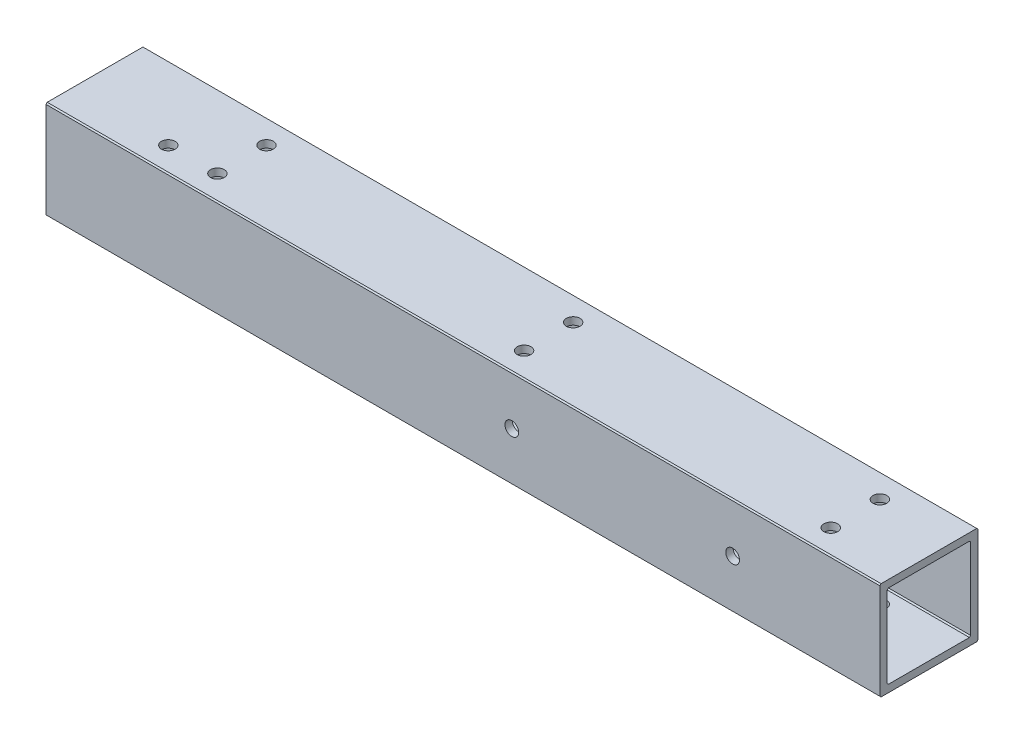
ISO-10303-21;
HEADER;
FILE_DESCRIPTION(('STEP AP214'),'2;1');
FILE_NAME('part.step','',(''),(''),'','','');
FILE_SCHEMA(('AUTOMOTIVE_DESIGN { 1 0 10303 214 1 1 1 1 }'));
ENDSEC;
DATA;
#1=APPLICATION_CONTEXT('core data for automotive mechanical design processes');
#2=APPLICATION_PROTOCOL_DEFINITION('international standard','automotive_design',2000,#1);
#3=PRODUCT_CONTEXT('',#1,'mechanical');
#4=PRODUCT('Part','Part','',(#3));
#5=PRODUCT_RELATED_PRODUCT_CATEGORY('part','',(#4));
#6=PRODUCT_DEFINITION_FORMATION('','',#4);
#7=PRODUCT_DEFINITION_CONTEXT('part definition',#1,'design');
#8=PRODUCT_DEFINITION('design','',#6,#7);
#9=PRODUCT_DEFINITION_SHAPE('','',#8);
#10=(LENGTH_UNIT() NAMED_UNIT(*) SI_UNIT(.MILLI.,.METRE.));
#11=(NAMED_UNIT(*) PLANE_ANGLE_UNIT() SI_UNIT($,.RADIAN.));
#12=(NAMED_UNIT(*) SI_UNIT($,.STERADIAN.) SOLID_ANGLE_UNIT());
#13=UNCERTAINTY_MEASURE_WITH_UNIT(LENGTH_MEASURE(1.E-05),#10,'distance_accuracy_value','');
#14=(GEOMETRIC_REPRESENTATION_CONTEXT(3) GLOBAL_UNCERTAINTY_ASSIGNED_CONTEXT((#13)) GLOBAL_UNIT_ASSIGNED_CONTEXT((#10,
#11,#12)) REPRESENTATION_CONTEXT('',''));
#15=CARTESIAN_POINT('',(0.,0.,0.));
#16=DIRECTION('',(0.,0.,1.));
#17=DIRECTION('',(1.,0.,0.));
#18=AXIS2_PLACEMENT_3D('',#15,#16,#17);
#19=CARTESIAN_POINT('',(-89.85,-142.,140.));
#20=DIRECTION('',(0.,0.,1.));
#21=DIRECTION('',(1.,0.,0.));
#22=AXIS2_PLACEMENT_3D('',#19,#20,#21);
#23=PLANE('',#22);
#24=CARTESIAN_POINT('',(190.,-122.,140.));
#25=DIRECTION('',(0.,0.,-1.));
#26=DIRECTION('',(-1.,0.,0.));
#27=AXIS2_PLACEMENT_3D('',#24,#25,#26);
#28=CIRCLE('',#27,2.8);
#29=CARTESIAN_POINT('',(187.2,-122.,140.));
#30=VERTEX_POINT('',#29);
#31=EDGE_CURVE('E605',#30,#30,#28,.T.);
#32=ORIENTED_EDGE('',*,*,#31,.T.);
#33=EDGE_LOOP('',(#32));
#34=FACE_BOUND('',#33,.T.);
#35=CARTESIAN_POINT('',(100.,-122.,140.));
#36=DIRECTION('',(0.,0.,-1.));
#37=DIRECTION('',(-1.,0.,0.));
#38=AXIS2_PLACEMENT_3D('',#35,#36,#37);
#39=CIRCLE('',#38,2.79999999999998);
#40=CARTESIAN_POINT('',(97.2,-122.,140.));
#41=VERTEX_POINT('',#40);
#42=EDGE_CURVE('E617',#41,#41,#39,.T.);
#43=ORIENTED_EDGE('',*,*,#42,.T.);
#44=EDGE_LOOP('',(#43));
#45=FACE_BOUND('',#44,.T.);
#46=DIRECTION('',(0.,1.,0.));
#47=VECTOR('',#46,1.);
#48=CARTESIAN_POINT('',(250.,-142.,140.));
#49=LINE('',#48,#47);
#50=CARTESIAN_POINT('',(250.,-141.5,140.));
#51=VERTEX_POINT('',#50);
#52=CARTESIAN_POINT('',(250.,-102.5,140.));
#53=VERTEX_POINT('',#52);
#54=EDGE_CURVE('E185',#51,#53,#49,.T.);
#55=ORIENTED_EDGE('',*,*,#54,.T.);
#56=DIRECTION('',(-1.,0.,0.));
#57=VECTOR('',#56,1.);
#58=CARTESIAN_POINT('',(-89.85,-102.5,140.));
#59=LINE('',#58,#57);
#60=CARTESIAN_POINT('',(-89.85,-102.5,140.));
#61=VERTEX_POINT('',#60);
#62=EDGE_CURVE('E229',#53,#61,#59,.T.);
#63=ORIENTED_EDGE('',*,*,#62,.T.);
#64=DIRECTION('',(0.,1.,0.));
#65=VECTOR('',#64,1.);
#66=CARTESIAN_POINT('',(-89.85,-142.,140.));
#67=LINE('',#66,#65);
#68=CARTESIAN_POINT('',(-89.85,-141.5,140.));
#69=VERTEX_POINT('',#68);
#70=EDGE_CURVE('E196',#69,#61,#67,.T.);
#71=ORIENTED_EDGE('',*,*,#70,.F.);
#72=DIRECTION('',(1.,0.,0.));
#73=VECTOR('',#72,1.);
#74=CARTESIAN_POINT('',(250.,-141.5,140.));
#75=LINE('',#74,#73);
#76=EDGE_CURVE('E226',#69,#51,#75,.T.);
#77=ORIENTED_EDGE('',*,*,#76,.T.);
#78=EDGE_LOOP('',(#55,#63,#71,#77));
#79=FACE_BOUND('',#78,.T.);
#80=ADVANCED_FACE('F45',(#34,#45,#79),#23,.T.);
#81=CARTESIAN_POINT('',(-89.85,-142.,100.));
#82=DIRECTION('',(-1.,0.,0.));
#83=DIRECTION('',(0.,0.,1.));
#84=AXIS2_PLACEMENT_3D('',#81,#82,#83);
#85=PLANE('',#84);
#86=DIRECTION('',(0.,-1.,0.));
#87=VECTOR('',#86,1.);
#88=CARTESIAN_POINT('',(-89.85,-105.,103.));
#89=LINE('',#88,#87);
#90=CARTESIAN_POINT('',(-89.85,-105.5,103.));
#91=VERTEX_POINT('',#90);
#92=CARTESIAN_POINT('',(-89.85,-138.5,103.));
#93=VERTEX_POINT('',#92);
#94=EDGE_CURVE('E286',#91,#93,#89,.T.);
#95=ORIENTED_EDGE('',*,*,#94,.F.);
#96=DIRECTION('',(0.,-0.707106781186548,-0.707106781186548));
#97=VECTOR('',#96,1.);
#98=CARTESIAN_POINT('',(-89.85,-105.5,103.));
#99=LINE('',#98,#97);
#100=CARTESIAN_POINT('',(-89.85,-105.,103.5));
#101=VERTEX_POINT('',#100);
#102=EDGE_CURVE('E55',#91,#101,#99,.F.);
#103=ORIENTED_EDGE('',*,*,#102,.T.);
#104=DIRECTION('',(0.,0.,-1.));
#105=VECTOR('',#104,1.);
#106=CARTESIAN_POINT('',(-89.85,-105.,137.));
#107=LINE('',#106,#105);
#108=CARTESIAN_POINT('',(-89.85,-105.,136.5));
#109=VERTEX_POINT('',#108);
#110=EDGE_CURVE('E284',#109,#101,#107,.T.);
#111=ORIENTED_EDGE('',*,*,#110,.F.);
#112=DIRECTION('',(0.,0.707106781186548,-0.707106781186548));
#113=VECTOR('',#112,1.);
#114=CARTESIAN_POINT('',(-89.85,-105.,136.5));
#115=LINE('',#114,#113);
#116=CARTESIAN_POINT('',(-89.85,-105.5,137.));
#117=VERTEX_POINT('',#116);
#118=EDGE_CURVE('E260',#109,#117,#115,.F.);
#119=ORIENTED_EDGE('',*,*,#118,.T.);
#120=DIRECTION('',(0.,1.,0.));
#121=VECTOR('',#120,1.);
#122=CARTESIAN_POINT('',(-89.85,-139.,137.));
#123=LINE('',#122,#121);
#124=CARTESIAN_POINT('',(-89.85,-138.5,137.));
#125=VERTEX_POINT('',#124);
#126=EDGE_CURVE('E297',#125,#117,#123,.T.);
#127=ORIENTED_EDGE('',*,*,#126,.F.);
#128=DIRECTION('',(0.,0.707106781186548,0.707106781186548));
#129=VECTOR('',#128,1.);
#130=CARTESIAN_POINT('',(-89.85,-138.5,137.));
#131=LINE('',#130,#129);
#132=CARTESIAN_POINT('',(-89.85,-139.,136.5));
#133=VERTEX_POINT('',#132);
#134=EDGE_CURVE('E272',#125,#133,#131,.F.);
#135=ORIENTED_EDGE('',*,*,#134,.T.);
#136=DIRECTION('',(0.,0.,1.));
#137=VECTOR('',#136,1.);
#138=CARTESIAN_POINT('',(-89.85,-139.,103.));
#139=LINE('',#138,#137);
#140=CARTESIAN_POINT('',(-89.85,-139.,103.5));
#141=VERTEX_POINT('',#140);
#142=EDGE_CURVE('E327',#141,#133,#139,.T.);
#143=ORIENTED_EDGE('',*,*,#142,.F.);
#144=DIRECTION('',(0.,-0.707106781186548,0.707106781186548));
#145=VECTOR('',#144,1.);
#146=CARTESIAN_POINT('',(-89.85,-139.,103.5));
#147=LINE('',#146,#145);
#148=EDGE_CURVE('E266',#141,#93,#147,.F.);
#149=ORIENTED_EDGE('',*,*,#148,.T.);
#150=EDGE_LOOP('',(#95,#103,#111,#119,#127,#135,#143,#149));
#151=FACE_BOUND('',#150,.T.);
#152=DIRECTION('',(0.,1.,0.));
#153=VECTOR('',#152,1.);
#154=CARTESIAN_POINT('',(-89.85,-142.,100.));
#155=LINE('',#154,#153);
#156=CARTESIAN_POINT('',(-89.85,-141.5,100.));
#157=VERTEX_POINT('',#156);
#158=CARTESIAN_POINT('',(-89.85,-102.5,100.));
#159=VERTEX_POINT('',#158);
#160=EDGE_CURVE('E184',#157,#159,#155,.T.);
#161=ORIENTED_EDGE('',*,*,#160,.F.);
#162=DIRECTION('',(0.,-0.707106781186548,0.707106781186548));
#163=VECTOR('',#162,1.);
#164=CARTESIAN_POINT('',(-89.85,-141.75,100.25));
#165=LINE('',#164,#163);
#166=CARTESIAN_POINT('',(-89.85,-142.,100.5));
#167=VERTEX_POINT('',#166);
#168=EDGE_CURVE('E188',#157,#167,#165,.T.);
#169=ORIENTED_EDGE('',*,*,#168,.T.);
#170=DIRECTION('',(0.,0.,1.));
#171=VECTOR('',#170,1.);
#172=CARTESIAN_POINT('',(-89.85,-142.,100.));
#173=LINE('',#172,#171);
#174=CARTESIAN_POINT('',(-89.85,-142.,139.5));
#175=VERTEX_POINT('',#174);
#176=EDGE_CURVE('E336',#167,#175,#173,.T.);
#177=ORIENTED_EDGE('',*,*,#176,.T.);
#178=DIRECTION('',(0.,0.707106781186548,0.707106781186548));
#179=VECTOR('',#178,1.);
#180=CARTESIAN_POINT('',(-89.85,-161.75,119.75));
#181=LINE('',#180,#179);
#182=EDGE_CURVE('E190',#175,#69,#181,.T.);
#183=ORIENTED_EDGE('',*,*,#182,.T.);
#184=ORIENTED_EDGE('',*,*,#70,.T.);
#185=DIRECTION('',(0.,-0.707106781186548,0.707106781186548));
#186=VECTOR('',#185,1.);
#187=CARTESIAN_POINT('',(-89.85,-102.25,139.75));
#188=LINE('',#187,#186);
#189=CARTESIAN_POINT('',(-89.85,-102.,139.5));
#190=VERTEX_POINT('',#189);
#191=EDGE_CURVE('E194',#61,#190,#188,.F.);
#192=ORIENTED_EDGE('',*,*,#191,.T.);
#193=DIRECTION('',(0.,0.,1.));
#194=VECTOR('',#193,1.);
#195=CARTESIAN_POINT('',(-89.85,-102.,100.));
#196=LINE('',#195,#194);
#197=CARTESIAN_POINT('',(-89.85,-102.,100.5));
#198=VERTEX_POINT('',#197);
#199=EDGE_CURVE('E337',#198,#190,#196,.T.);
#200=ORIENTED_EDGE('',*,*,#199,.F.);
#201=DIRECTION('',(0.,0.707106781186548,0.707106781186548));
#202=VECTOR('',#201,1.);
#203=CARTESIAN_POINT('',(-89.85,-122.25,80.25));
#204=LINE('',#203,#202);
#205=EDGE_CURVE('E202',#198,#159,#204,.F.);
#206=ORIENTED_EDGE('',*,*,#205,.T.);
#207=EDGE_LOOP('',(#161,#169,#177,#183,#184,#192,#200,#206));
#208=FACE_BOUND('',#207,.T.);
#209=ADVANCED_FACE('F282',(#151,#208),#85,.T.);
#210=CARTESIAN_POINT('',(250.,-142.,100.));
#211=DIRECTION('',(0.,0.,-1.));
#212=DIRECTION('',(-1.,0.,0.));
#213=AXIS2_PLACEMENT_3D('',#210,#211,#212);
#214=PLANE('',#213);
#215=CARTESIAN_POINT('',(190.,-122.,100.));
#216=DIRECTION('',(0.,0.,-1.));
#217=DIRECTION('',(-1.,0.,0.));
#218=AXIS2_PLACEMENT_3D('',#215,#216,#217);
#219=CIRCLE('',#218,2.8);
#220=CARTESIAN_POINT('',(187.2,-122.,100.));
#221=VERTEX_POINT('',#220);
#222=EDGE_CURVE('E476',#221,#221,#219,.T.);
#223=ORIENTED_EDGE('',*,*,#222,.F.);
#224=EDGE_LOOP('',(#223));
#225=FACE_BOUND('',#224,.T.);
#226=CARTESIAN_POINT('',(100.,-122.,100.));
#227=DIRECTION('',(0.,0.,-1.));
#228=DIRECTION('',(-1.,0.,0.));
#229=AXIS2_PLACEMENT_3D('',#226,#227,#228);
#230=CIRCLE('',#229,2.79999999999998);
#231=CARTESIAN_POINT('',(97.2,-122.,100.));
#232=VERTEX_POINT('',#231);
#233=EDGE_CURVE('E479',#232,#232,#230,.T.);
#234=ORIENTED_EDGE('',*,*,#233,.F.);
#235=EDGE_LOOP('',(#234));
#236=FACE_BOUND('',#235,.T.);
#237=DIRECTION('',(0.,1.,0.));
#238=VECTOR('',#237,1.);
#239=CARTESIAN_POINT('',(250.,-142.,100.));
#240=LINE('',#239,#238);
#241=CARTESIAN_POINT('',(250.,-141.5,100.));
#242=VERTEX_POINT('',#241);
#243=CARTESIAN_POINT('',(250.,-102.5,100.));
#244=VERTEX_POINT('',#243);
#245=EDGE_CURVE('E164',#242,#244,#240,.T.);
#246=ORIENTED_EDGE('',*,*,#245,.F.);
#247=DIRECTION('',(-1.,0.,0.));
#248=VECTOR('',#247,1.);
#249=CARTESIAN_POINT('',(-89.85,-141.5,100.));
#250=LINE('',#249,#248);
#251=EDGE_CURVE('E179',#242,#157,#250,.T.);
#252=ORIENTED_EDGE('',*,*,#251,.T.);
#253=ORIENTED_EDGE('',*,*,#160,.T.);
#254=DIRECTION('',(1.,0.,0.));
#255=VECTOR('',#254,1.);
#256=CARTESIAN_POINT('',(250.,-102.5,100.));
#257=LINE('',#256,#255);
#258=EDGE_CURVE('E182',#159,#244,#257,.T.);
#259=ORIENTED_EDGE('',*,*,#258,.T.);
#260=EDGE_LOOP('',(#246,#252,#253,#259));
#261=FACE_BOUND('',#260,.T.);
#262=ADVANCED_FACE('F177',(#225,#236,#261),#214,.T.);
#263=CARTESIAN_POINT('',(250.,-142.,140.));
#264=DIRECTION('',(1.,0.,0.));
#265=DIRECTION('',(0.,0.,-1.));
#266=AXIS2_PLACEMENT_3D('',#263,#264,#265);
#267=PLANE('',#266);
#268=DIRECTION('',(0.,0.,-1.));
#269=VECTOR('',#268,1.);
#270=CARTESIAN_POINT('',(250.,-105.,137.));
#271=LINE('',#270,#269);
#272=CARTESIAN_POINT('',(250.,-105.,136.5));
#273=VERTEX_POINT('',#272);
#274=CARTESIAN_POINT('',(250.,-105.,103.5));
#275=VERTEX_POINT('',#274);
#276=EDGE_CURVE('E304',#273,#275,#271,.T.);
#277=ORIENTED_EDGE('',*,*,#276,.T.);
#278=DIRECTION('',(0.,0.707106781186548,0.707106781186548));
#279=VECTOR('',#278,1.);
#280=CARTESIAN_POINT('',(250.,-105.5,103.));
#281=LINE('',#280,#279);
#282=CARTESIAN_POINT('',(250.,-105.5,103.));
#283=VERTEX_POINT('',#282);
#284=EDGE_CURVE('E11',#275,#283,#281,.F.);
#285=ORIENTED_EDGE('',*,*,#284,.T.);
#286=DIRECTION('',(0.,-1.,0.));
#287=VECTOR('',#286,1.);
#288=CARTESIAN_POINT('',(250.,-105.,103.));
#289=LINE('',#288,#287);
#290=CARTESIAN_POINT('',(250.,-138.5,103.));
#291=VERTEX_POINT('',#290);
#292=EDGE_CURVE('E296',#283,#291,#289,.T.);
#293=ORIENTED_EDGE('',*,*,#292,.T.);
#294=DIRECTION('',(0.,0.707106781186548,-0.707106781186548));
#295=VECTOR('',#294,1.);
#296=CARTESIAN_POINT('',(250.,-139.,103.5));
#297=LINE('',#296,#295);
#298=CARTESIAN_POINT('',(250.,-139.,103.5));
#299=VERTEX_POINT('',#298);
#300=EDGE_CURVE('E269',#291,#299,#297,.F.);
#301=ORIENTED_EDGE('',*,*,#300,.T.);
#302=DIRECTION('',(0.,0.,1.));
#303=VECTOR('',#302,1.);
#304=CARTESIAN_POINT('',(250.,-139.,103.));
#305=LINE('',#304,#303);
#306=CARTESIAN_POINT('',(250.,-139.,136.5));
#307=VERTEX_POINT('',#306);
#308=EDGE_CURVE('E309',#299,#307,#305,.T.);
#309=ORIENTED_EDGE('',*,*,#308,.T.);
#310=DIRECTION('',(0.,-0.707106781186548,-0.707106781186548));
#311=VECTOR('',#310,1.);
#312=CARTESIAN_POINT('',(250.,-138.5,137.));
#313=LINE('',#312,#311);
#314=CARTESIAN_POINT('',(250.,-138.5,137.));
#315=VERTEX_POINT('',#314);
#316=EDGE_CURVE('E275',#307,#315,#313,.F.);
#317=ORIENTED_EDGE('',*,*,#316,.T.);
#318=DIRECTION('',(0.,1.,0.));
#319=VECTOR('',#318,1.);
#320=CARTESIAN_POINT('',(250.,-139.,137.));
#321=LINE('',#320,#319);
#322=CARTESIAN_POINT('',(250.,-105.5,137.));
#323=VERTEX_POINT('',#322);
#324=EDGE_CURVE('E313',#315,#323,#321,.T.);
#325=ORIENTED_EDGE('',*,*,#324,.T.);
#326=DIRECTION('',(0.,-0.707106781186548,0.707106781186548));
#327=VECTOR('',#326,1.);
#328=CARTESIAN_POINT('',(250.,-105.,136.5));
#329=LINE('',#328,#327);
#330=EDGE_CURVE('E263',#323,#273,#329,.F.);
#331=ORIENTED_EDGE('',*,*,#330,.T.);
#332=EDGE_LOOP('',(#277,#285,#293,#301,#309,#317,#325,#331));
#333=FACE_BOUND('',#332,.T.);
#334=DIRECTION('',(0.,0.,-1.));
#335=VECTOR('',#334,1.);
#336=CARTESIAN_POINT('',(250.,-142.,140.));
#337=LINE('',#336,#335);
#338=CARTESIAN_POINT('',(250.,-142.,139.5));
#339=VERTEX_POINT('',#338);
#340=CARTESIAN_POINT('',(250.,-142.,100.5));
#341=VERTEX_POINT('',#340);
#342=EDGE_CURVE('E167',#339,#341,#337,.T.);
#343=ORIENTED_EDGE('',*,*,#342,.T.);
#344=DIRECTION('',(0.,0.707106781186548,-0.707106781186548));
#345=VECTOR('',#344,1.);
#346=CARTESIAN_POINT('',(250.,-161.75,120.25));
#347=LINE('',#346,#345);
#348=EDGE_CURVE('E161',#341,#242,#347,.T.);
#349=ORIENTED_EDGE('',*,*,#348,.T.);
#350=ORIENTED_EDGE('',*,*,#245,.T.);
#351=DIRECTION('',(0.,-0.707106781186548,-0.707106781186548));
#352=VECTOR('',#351,1.);
#353=CARTESIAN_POINT('',(250.,-102.25,100.25));
#354=LINE('',#353,#352);
#355=CARTESIAN_POINT('',(250.,-102.,100.5));
#356=VERTEX_POINT('',#355);
#357=EDGE_CURVE('E173',#244,#356,#354,.F.);
#358=ORIENTED_EDGE('',*,*,#357,.T.);
#359=DIRECTION('',(0.,0.,-1.));
#360=VECTOR('',#359,1.);
#361=CARTESIAN_POINT('',(250.,-102.,140.));
#362=LINE('',#361,#360);
#363=CARTESIAN_POINT('',(250.,-102.,139.5));
#364=VERTEX_POINT('',#363);
#365=EDGE_CURVE('E324',#364,#356,#362,.T.);
#366=ORIENTED_EDGE('',*,*,#365,.F.);
#367=DIRECTION('',(0.,0.707106781186548,-0.707106781186548));
#368=VECTOR('',#367,1.);
#369=CARTESIAN_POINT('',(250.,-122.25,159.75));
#370=LINE('',#369,#368);
#371=EDGE_CURVE('E62',#364,#53,#370,.F.);
#372=ORIENTED_EDGE('',*,*,#371,.T.);
#373=ORIENTED_EDGE('',*,*,#54,.F.);
#374=DIRECTION('',(0.,-0.707106781186548,-0.707106781186548));
#375=VECTOR('',#374,1.);
#376=CARTESIAN_POINT('',(250.,-141.75,139.75));
#377=LINE('',#376,#375);
#378=EDGE_CURVE('E70',#51,#339,#377,.T.);
#379=ORIENTED_EDGE('',*,*,#378,.T.);
#380=EDGE_LOOP('',(#343,#349,#350,#358,#366,#372,#373,#379));
#381=FACE_BOUND('',#380,.T.);
#382=ADVANCED_FACE('F163',(#333,#381),#267,.T.);
#383=CARTESIAN_POINT('',(0.,-142.,0.));
#384=DIRECTION('',(0.,1.,0.));
#385=DIRECTION('',(0.,0.,1.));
#386=AXIS2_PLACEMENT_3D('',#383,#384,#385);
#387=PLANE('',#386);
#388=CARTESIAN_POINT('',(220.,-142.,130.));
#389=DIRECTION('',(0.,1.,0.));
#390=DIRECTION('',(0.,0.,1.));
#391=AXIS2_PLACEMENT_3D('',#388,#389,#390);
#392=CIRCLE('',#391,2.8);
#393=CARTESIAN_POINT('',(220.,-142.,132.8));
#394=VERTEX_POINT('',#393);
#395=EDGE_CURVE('E497',#394,#394,#392,.T.);
#396=ORIENTED_EDGE('',*,*,#395,.T.);
#397=EDGE_LOOP('',(#396));
#398=FACE_BOUND('',#397,.T.);
#399=CARTESIAN_POINT('',(95.,-142.,130.));
#400=DIRECTION('',(0.,1.,0.));
#401=DIRECTION('',(0.,0.,1.));
#402=AXIS2_PLACEMENT_3D('',#399,#400,#401);
#403=CIRCLE('',#402,2.79999999999998);
#404=CARTESIAN_POINT('',(95.,-142.,132.8));
#405=VERTEX_POINT('',#404);
#406=EDGE_CURVE('E505',#405,#405,#403,.T.);
#407=ORIENTED_EDGE('',*,*,#406,.T.);
#408=EDGE_LOOP('',(#407));
#409=FACE_BOUND('',#408,.T.);
#410=CARTESIAN_POINT('',(220.,-142.,110.));
#411=DIRECTION('',(0.,1.,0.));
#412=DIRECTION('',(0.,0.,1.));
#413=AXIS2_PLACEMENT_3D('',#410,#411,#412);
#414=CIRCLE('',#413,2.8);
#415=CARTESIAN_POINT('',(220.,-142.,112.8));
#416=VERTEX_POINT('',#415);
#417=EDGE_CURVE('E513',#416,#416,#414,.T.);
#418=ORIENTED_EDGE('',*,*,#417,.T.);
#419=EDGE_LOOP('',(#418));
#420=FACE_BOUND('',#419,.T.);
#421=CARTESIAN_POINT('',(95.,-142.,110.));
#422=DIRECTION('',(0.,1.,0.));
#423=DIRECTION('',(0.,0.,1.));
#424=AXIS2_PLACEMENT_3D('',#421,#422,#423);
#425=CIRCLE('',#424,2.79999999999998);
#426=CARTESIAN_POINT('',(95.,-142.,112.8));
#427=VERTEX_POINT('',#426);
#428=EDGE_CURVE('E521',#427,#427,#425,.T.);
#429=ORIENTED_EDGE('',*,*,#428,.T.);
#430=EDGE_LOOP('',(#429));
#431=FACE_BOUND('',#430,.T.);
#432=CARTESIAN_POINT('',(-30.,-142.,130.));
#433=DIRECTION('',(0.,1.,0.));
#434=DIRECTION('',(0.,0.,1.));
#435=AXIS2_PLACEMENT_3D('',#432,#433,#434);
#436=CIRCLE('',#435,2.79999999999998);
#437=CARTESIAN_POINT('',(-30.,-142.,132.8));
#438=VERTEX_POINT('',#437);
#439=EDGE_CURVE('E529',#438,#438,#436,.T.);
#440=ORIENTED_EDGE('',*,*,#439,.T.);
#441=EDGE_LOOP('',(#440));
#442=FACE_BOUND('',#441,.T.);
#443=CARTESIAN_POINT('',(-50.,-142.,130.));
#444=DIRECTION('',(0.,1.,0.));
#445=DIRECTION('',(0.,0.,1.));
#446=AXIS2_PLACEMENT_3D('',#443,#444,#445);
#447=CIRCLE('',#446,2.79999999999998);
#448=CARTESIAN_POINT('',(-50.,-142.,132.8));
#449=VERTEX_POINT('',#448);
#450=EDGE_CURVE('E537',#449,#449,#447,.T.);
#451=ORIENTED_EDGE('',*,*,#450,.T.);
#452=EDGE_LOOP('',(#451));
#453=FACE_BOUND('',#452,.T.);
#454=CARTESIAN_POINT('',(-30.,-142.,110.));
#455=DIRECTION('',(0.,1.,0.));
#456=DIRECTION('',(0.,0.,1.));
#457=AXIS2_PLACEMENT_3D('',#454,#455,#456);
#458=CIRCLE('',#457,2.79999999999998);
#459=CARTESIAN_POINT('',(-30.,-142.,112.8));
#460=VERTEX_POINT('',#459);
#461=EDGE_CURVE('E316',#460,#460,#458,.T.);
#462=ORIENTED_EDGE('',*,*,#461,.T.);
#463=EDGE_LOOP('',(#462));
#464=FACE_BOUND('',#463,.T.);
#465=ORIENTED_EDGE('',*,*,#176,.F.);
#466=DIRECTION('',(1.,0.,0.));
#467=VECTOR('',#466,1.);
#468=CARTESIAN_POINT('',(250.,-142.,100.5));
#469=LINE('',#468,#467);
#470=EDGE_CURVE('E210',#167,#341,#469,.T.);
#471=ORIENTED_EDGE('',*,*,#470,.T.);
#472=ORIENTED_EDGE('',*,*,#342,.F.);
#473=DIRECTION('',(-1.,0.,0.));
#474=VECTOR('',#473,1.);
#475=CARTESIAN_POINT('',(-89.85,-142.,139.5));
#476=LINE('',#475,#474);
#477=EDGE_CURVE('E207',#339,#175,#476,.T.);
#478=ORIENTED_EDGE('',*,*,#477,.T.);
#479=EDGE_LOOP('',(#465,#471,#472,#478));
#480=FACE_BOUND('',#479,.T.);
#481=ADVANCED_FACE('F368',(#398,#409,#420,#431,#442,#453,#464,#480),#387,.F.);
#482=CARTESIAN_POINT('',(0.,-102.,0.));
#483=DIRECTION('',(0.,1.,0.));
#484=DIRECTION('',(0.,0.,1.));
#485=AXIS2_PLACEMENT_3D('',#482,#483,#484);
#486=PLANE('',#485);
#487=CARTESIAN_POINT('',(220.,-102.,130.));
#488=DIRECTION('',(0.,1.,0.));
#489=DIRECTION('',(0.,0.,1.));
#490=AXIS2_PLACEMENT_3D('',#487,#488,#489);
#491=CIRCLE('',#490,2.8);
#492=CARTESIAN_POINT('',(220.,-102.,132.8));
#493=VERTEX_POINT('',#492);
#494=EDGE_CURVE('E967',#493,#493,#491,.T.);
#495=ORIENTED_EDGE('',*,*,#494,.F.);
#496=EDGE_LOOP('',(#495));
#497=FACE_BOUND('',#496,.T.);
#498=CARTESIAN_POINT('',(95.,-102.,130.));
#499=DIRECTION('',(0.,1.,0.));
#500=DIRECTION('',(0.,0.,1.));
#501=AXIS2_PLACEMENT_3D('',#498,#499,#500);
#502=CIRCLE('',#501,2.79999999999998);
#503=CARTESIAN_POINT('',(95.,-102.,132.8));
#504=VERTEX_POINT('',#503);
#505=EDGE_CURVE('E969',#504,#504,#502,.T.);
#506=ORIENTED_EDGE('',*,*,#505,.F.);
#507=EDGE_LOOP('',(#506));
#508=FACE_BOUND('',#507,.T.);
#509=CARTESIAN_POINT('',(220.,-102.,110.));
#510=DIRECTION('',(0.,1.,0.));
#511=DIRECTION('',(0.,0.,1.));
#512=AXIS2_PLACEMENT_3D('',#509,#510,#511);
#513=CIRCLE('',#512,2.8);
#514=CARTESIAN_POINT('',(220.,-102.,112.8));
#515=VERTEX_POINT('',#514);
#516=EDGE_CURVE('E979',#515,#515,#513,.T.);
#517=ORIENTED_EDGE('',*,*,#516,.F.);
#518=EDGE_LOOP('',(#517));
#519=FACE_BOUND('',#518,.T.);
#520=CARTESIAN_POINT('',(95.,-102.,110.));
#521=DIRECTION('',(0.,1.,0.));
#522=DIRECTION('',(0.,0.,1.));
#523=AXIS2_PLACEMENT_3D('',#520,#521,#522);
#524=CIRCLE('',#523,2.79999999999998);
#525=CARTESIAN_POINT('',(95.,-102.,112.8));
#526=VERTEX_POINT('',#525);
#527=EDGE_CURVE('E985',#526,#526,#524,.T.);
#528=ORIENTED_EDGE('',*,*,#527,.F.);
#529=EDGE_LOOP('',(#528));
#530=FACE_BOUND('',#529,.T.);
#531=CARTESIAN_POINT('',(-30.,-102.,130.));
#532=DIRECTION('',(0.,1.,0.));
#533=DIRECTION('',(0.,0.,1.));
#534=AXIS2_PLACEMENT_3D('',#531,#532,#533);
#535=CIRCLE('',#534,2.79999999999998);
#536=CARTESIAN_POINT('',(-30.,-102.,132.8));
#537=VERTEX_POINT('',#536);
#538=EDGE_CURVE('E991',#537,#537,#535,.T.);
#539=ORIENTED_EDGE('',*,*,#538,.F.);
#540=EDGE_LOOP('',(#539));
#541=FACE_BOUND('',#540,.T.);
#542=CARTESIAN_POINT('',(-50.,-102.,130.));
#543=DIRECTION('',(0.,1.,0.));
#544=DIRECTION('',(0.,0.,1.));
#545=AXIS2_PLACEMENT_3D('',#542,#543,#544);
#546=CIRCLE('',#545,2.79999999999998);
#547=CARTESIAN_POINT('',(-50.,-102.,132.8));
#548=VERTEX_POINT('',#547);
#549=EDGE_CURVE('E997',#548,#548,#546,.T.);
#550=ORIENTED_EDGE('',*,*,#549,.F.);
#551=EDGE_LOOP('',(#550));
#552=FACE_BOUND('',#551,.T.);
#553=CARTESIAN_POINT('',(-30.,-102.,110.));
#554=DIRECTION('',(0.,1.,0.));
#555=DIRECTION('',(0.,0.,1.));
#556=AXIS2_PLACEMENT_3D('',#553,#554,#555);
#557=CIRCLE('',#556,2.79999999999998);
#558=CARTESIAN_POINT('',(-30.,-102.,112.8));
#559=VERTEX_POINT('',#558);
#560=EDGE_CURVE('E600',#559,#559,#557,.T.);
#561=ORIENTED_EDGE('',*,*,#560,.F.);
#562=EDGE_LOOP('',(#561));
#563=FACE_BOUND('',#562,.T.);
#564=ORIENTED_EDGE('',*,*,#365,.T.);
#565=DIRECTION('',(-1.,0.,0.));
#566=VECTOR('',#565,1.);
#567=CARTESIAN_POINT('',(0.,-102.,100.5));
#568=LINE('',#567,#566);
#569=EDGE_CURVE('E222',#356,#198,#568,.T.);
#570=ORIENTED_EDGE('',*,*,#569,.T.);
#571=ORIENTED_EDGE('',*,*,#199,.T.);
#572=DIRECTION('',(1.,0.,0.));
#573=VECTOR('',#572,1.);
#574=CARTESIAN_POINT('',(0.,-102.,139.5));
#575=LINE('',#574,#573);
#576=EDGE_CURVE('E172',#190,#364,#575,.T.);
#577=ORIENTED_EDGE('',*,*,#576,.T.);
#578=EDGE_LOOP('',(#564,#570,#571,#577));
#579=FACE_BOUND('',#578,.T.);
#580=ADVANCED_FACE('F361',(#497,#508,#519,#530,#541,#552,#563,#579),#486,.T.);
#581=CARTESIAN_POINT('',(250.,-105.,103.));
#582=DIRECTION('',(0.,0.,-1.));
#583=DIRECTION('',(-1.,0.,0.));
#584=AXIS2_PLACEMENT_3D('',#581,#582,#583);
#585=PLANE('',#584);
#586=CARTESIAN_POINT('',(190.,-122.,103.));
#587=DIRECTION('',(0.,0.,-1.));
#588=DIRECTION('',(-1.,0.,0.));
#589=AXIS2_PLACEMENT_3D('',#586,#587,#588);
#590=CIRCLE('',#589,2.8);
#591=CARTESIAN_POINT('',(187.2,-122.,103.));
#592=VERTEX_POINT('',#591);
#593=EDGE_CURVE('E483',#592,#592,#590,.T.);
#594=ORIENTED_EDGE('',*,*,#593,.T.);
#595=EDGE_LOOP('',(#594));
#596=FACE_BOUND('',#595,.T.);
#597=CARTESIAN_POINT('',(100.,-122.,103.));
#598=DIRECTION('',(0.,0.,-1.));
#599=DIRECTION('',(-1.,0.,0.));
#600=AXIS2_PLACEMENT_3D('',#597,#598,#599);
#601=CIRCLE('',#600,2.79999999999999);
#602=CARTESIAN_POINT('',(97.2,-122.,103.));
#603=VERTEX_POINT('',#602);
#604=EDGE_CURVE('E482',#603,#603,#601,.T.);
#605=ORIENTED_EDGE('',*,*,#604,.T.);
#606=EDGE_LOOP('',(#605));
#607=FACE_BOUND('',#606,.T.);
#608=ORIENTED_EDGE('',*,*,#94,.T.);
#609=DIRECTION('',(1.,0.,0.));
#610=VECTOR('',#609,1.);
#611=CARTESIAN_POINT('',(250.,-138.5,103.));
#612=LINE('',#611,#610);
#613=EDGE_CURVE('E257',#93,#291,#612,.T.);
#614=ORIENTED_EDGE('',*,*,#613,.T.);
#615=ORIENTED_EDGE('',*,*,#292,.F.);
#616=DIRECTION('',(-1.,0.,0.));
#617=VECTOR('',#616,1.);
#618=CARTESIAN_POINT('',(-89.85,-105.5,103.));
#619=LINE('',#618,#617);
#620=EDGE_CURVE('E253',#283,#91,#619,.T.);
#621=ORIENTED_EDGE('',*,*,#620,.T.);
#622=EDGE_LOOP('',(#608,#614,#615,#621));
#623=FACE_BOUND('',#622,.T.);
#624=ADVANCED_FACE('F306',(#596,#607,#623),#585,.F.);
#625=CARTESIAN_POINT('',(250.,-105.,137.));
#626=DIRECTION('',(0.,1.,0.));
#627=DIRECTION('',(0.,0.,1.));
#628=AXIS2_PLACEMENT_3D('',#625,#626,#627);
#629=PLANE('',#628);
#630=CARTESIAN_POINT('',(220.,-105.,130.));
#631=DIRECTION('',(0.,1.,0.));
#632=DIRECTION('',(0.,0.,1.));
#633=AXIS2_PLACEMENT_3D('',#630,#631,#632);
#634=CIRCLE('',#633,2.79999999999998);
#635=CARTESIAN_POINT('',(220.,-105.,132.8));
#636=VERTEX_POINT('',#635);
#637=EDGE_CURVE('E573',#636,#636,#634,.T.);
#638=ORIENTED_EDGE('',*,*,#637,.T.);
#639=EDGE_LOOP('',(#638));
#640=FACE_BOUND('',#639,.T.);
#641=CARTESIAN_POINT('',(95.,-105.,130.));
#642=DIRECTION('',(0.,1.,0.));
#643=DIRECTION('',(0.,0.,1.));
#644=AXIS2_PLACEMENT_3D('',#641,#642,#643);
#645=CIRCLE('',#644,2.79999999999998);
#646=CARTESIAN_POINT('',(95.,-105.,132.8));
#647=VERTEX_POINT('',#646);
#648=EDGE_CURVE('E577',#647,#647,#645,.T.);
#649=ORIENTED_EDGE('',*,*,#648,.T.);
#650=EDGE_LOOP('',(#649));
#651=FACE_BOUND('',#650,.T.);
#652=CARTESIAN_POINT('',(220.,-105.,110.));
#653=DIRECTION('',(0.,1.,0.));
#654=DIRECTION('',(0.,0.,1.));
#655=AXIS2_PLACEMENT_3D('',#652,#653,#654);
#656=CIRCLE('',#655,2.79999999999998);
#657=CARTESIAN_POINT('',(220.,-105.,112.8));
#658=VERTEX_POINT('',#657);
#659=EDGE_CURVE('E581',#658,#658,#656,.T.);
#660=ORIENTED_EDGE('',*,*,#659,.T.);
#661=EDGE_LOOP('',(#660));
#662=FACE_BOUND('',#661,.T.);
#663=CARTESIAN_POINT('',(95.,-105.,110.));
#664=DIRECTION('',(0.,1.,0.));
#665=DIRECTION('',(0.,0.,1.));
#666=AXIS2_PLACEMENT_3D('',#663,#664,#665);
#667=CIRCLE('',#666,2.79999999999998);
#668=CARTESIAN_POINT('',(95.,-105.,112.8));
#669=VERTEX_POINT('',#668);
#670=EDGE_CURVE('E585',#669,#669,#667,.T.);
#671=ORIENTED_EDGE('',*,*,#670,.T.);
#672=EDGE_LOOP('',(#671));
#673=FACE_BOUND('',#672,.T.);
#674=CARTESIAN_POINT('',(-30.,-105.,130.));
#675=DIRECTION('',(0.,1.,0.));
#676=DIRECTION('',(0.,0.,1.));
#677=AXIS2_PLACEMENT_3D('',#674,#675,#676);
#678=CIRCLE('',#677,2.79999999999998);
#679=CARTESIAN_POINT('',(-30.,-105.,132.8));
#680=VERTEX_POINT('',#679);
#681=EDGE_CURVE('E589',#680,#680,#678,.T.);
#682=ORIENTED_EDGE('',*,*,#681,.T.);
#683=EDGE_LOOP('',(#682));
#684=FACE_BOUND('',#683,.T.);
#685=CARTESIAN_POINT('',(-50.,-105.,130.));
#686=DIRECTION('',(0.,1.,0.));
#687=DIRECTION('',(0.,0.,1.));
#688=AXIS2_PLACEMENT_3D('',#685,#686,#687);
#689=CIRCLE('',#688,2.79999999999998);
#690=CARTESIAN_POINT('',(-50.,-105.,132.8));
#691=VERTEX_POINT('',#690);
#692=EDGE_CURVE('E593',#691,#691,#689,.T.);
#693=ORIENTED_EDGE('',*,*,#692,.T.);
#694=EDGE_LOOP('',(#693));
#695=FACE_BOUND('',#694,.T.);
#696=CARTESIAN_POINT('',(-30.,-105.,110.));
#697=DIRECTION('',(0.,1.,0.));
#698=DIRECTION('',(0.,0.,1.));
#699=AXIS2_PLACEMENT_3D('',#696,#697,#698);
#700=CIRCLE('',#699,2.79999999999998);
#701=CARTESIAN_POINT('',(-30.,-105.,112.8));
#702=VERTEX_POINT('',#701);
#703=EDGE_CURVE('E596',#702,#702,#700,.T.);
#704=ORIENTED_EDGE('',*,*,#703,.T.);
#705=EDGE_LOOP('',(#704));
#706=FACE_BOUND('',#705,.T.);
#707=ORIENTED_EDGE('',*,*,#276,.F.);
#708=DIRECTION('',(-1.,0.,0.));
#709=VECTOR('',#708,1.);
#710=CARTESIAN_POINT('',(-89.85,-105.,136.5));
#711=LINE('',#710,#709);
#712=EDGE_CURVE('E235',#273,#109,#711,.T.);
#713=ORIENTED_EDGE('',*,*,#712,.T.);
#714=ORIENTED_EDGE('',*,*,#110,.T.);
#715=DIRECTION('',(1.,0.,0.));
#716=VECTOR('',#715,1.);
#717=CARTESIAN_POINT('',(250.,-105.,103.5));
#718=LINE('',#717,#716);
#719=EDGE_CURVE('E232',#101,#275,#718,.T.);
#720=ORIENTED_EDGE('',*,*,#719,.T.);
#721=EDGE_LOOP('',(#707,#713,#714,#720));
#722=FACE_BOUND('',#721,.T.);
#723=ADVANCED_FACE('F292',(#640,#651,#662,#673,#684,#695,#706,#722),#629,.F.);
#724=CARTESIAN_POINT('',(250.,-139.,137.));
#725=DIRECTION('',(0.,0.,1.));
#726=DIRECTION('',(1.,0.,0.));
#727=AXIS2_PLACEMENT_3D('',#724,#725,#726);
#728=PLANE('',#727);
#729=CARTESIAN_POINT('',(190.,-122.,137.));
#730=DIRECTION('',(0.,0.,-1.));
#731=DIRECTION('',(-1.,0.,0.));
#732=AXIS2_PLACEMENT_3D('',#729,#730,#731);
#733=CIRCLE('',#732,2.8);
#734=CARTESIAN_POINT('',(187.2,-122.,137.));
#735=VERTEX_POINT('',#734);
#736=EDGE_CURVE('E599',#735,#735,#733,.T.);
#737=ORIENTED_EDGE('',*,*,#736,.F.);
#738=EDGE_LOOP('',(#737));
#739=FACE_BOUND('',#738,.T.);
#740=CARTESIAN_POINT('',(100.,-122.,137.));
#741=DIRECTION('',(0.,0.,-1.));
#742=DIRECTION('',(-1.,0.,0.));
#743=AXIS2_PLACEMENT_3D('',#740,#741,#742);
#744=CIRCLE('',#743,2.79999999999998);
#745=CARTESIAN_POINT('',(97.2,-122.,137.));
#746=VERTEX_POINT('',#745);
#747=EDGE_CURVE('E613',#746,#746,#744,.T.);
#748=ORIENTED_EDGE('',*,*,#747,.F.);
#749=EDGE_LOOP('',(#748));
#750=FACE_BOUND('',#749,.T.);
#751=ORIENTED_EDGE('',*,*,#126,.T.);
#752=DIRECTION('',(1.,0.,0.));
#753=VECTOR('',#752,1.);
#754=CARTESIAN_POINT('',(250.,-105.5,137.));
#755=LINE('',#754,#753);
#756=EDGE_CURVE('E243',#117,#323,#755,.T.);
#757=ORIENTED_EDGE('',*,*,#756,.T.);
#758=ORIENTED_EDGE('',*,*,#324,.F.);
#759=DIRECTION('',(-1.,0.,0.));
#760=VECTOR('',#759,1.);
#761=CARTESIAN_POINT('',(-89.85,-138.5,137.));
#762=LINE('',#761,#760);
#763=EDGE_CURVE('E239',#315,#125,#762,.T.);
#764=ORIENTED_EDGE('',*,*,#763,.T.);
#765=EDGE_LOOP('',(#751,#757,#758,#764));
#766=FACE_BOUND('',#765,.T.);
#767=ADVANCED_FACE('F436',(#739,#750,#766),#728,.F.);
#768=CARTESIAN_POINT('',(250.,-139.,103.));
#769=DIRECTION('',(0.,-1.,0.));
#770=DIRECTION('',(0.,0.,-1.));
#771=AXIS2_PLACEMENT_3D('',#768,#769,#770);
#772=PLANE('',#771);
#773=CARTESIAN_POINT('',(220.,-139.,130.));
#774=DIRECTION('',(0.,1.,0.));
#775=DIRECTION('',(0.,0.,1.));
#776=AXIS2_PLACEMENT_3D('',#773,#774,#775);
#777=CIRCLE('',#776,2.8);
#778=CARTESIAN_POINT('',(220.,-139.,132.8));
#779=VERTEX_POINT('',#778);
#780=EDGE_CURVE('E488',#779,#779,#777,.T.);
#781=ORIENTED_EDGE('',*,*,#780,.F.);
#782=EDGE_LOOP('',(#781));
#783=FACE_BOUND('',#782,.T.);
#784=CARTESIAN_POINT('',(95.,-139.,130.));
#785=DIRECTION('',(0.,1.,0.));
#786=DIRECTION('',(0.,0.,1.));
#787=AXIS2_PLACEMENT_3D('',#784,#785,#786);
#788=CIRCLE('',#787,2.79999999999998);
#789=CARTESIAN_POINT('',(95.,-139.,132.8));
#790=VERTEX_POINT('',#789);
#791=EDGE_CURVE('E501',#790,#790,#788,.T.);
#792=ORIENTED_EDGE('',*,*,#791,.F.);
#793=EDGE_LOOP('',(#792));
#794=FACE_BOUND('',#793,.T.);
#795=CARTESIAN_POINT('',(220.,-139.,110.));
#796=DIRECTION('',(0.,1.,0.));
#797=DIRECTION('',(0.,0.,1.));
#798=AXIS2_PLACEMENT_3D('',#795,#796,#797);
#799=CIRCLE('',#798,2.8);
#800=CARTESIAN_POINT('',(220.,-139.,112.8));
#801=VERTEX_POINT('',#800);
#802=EDGE_CURVE('E509',#801,#801,#799,.T.);
#803=ORIENTED_EDGE('',*,*,#802,.F.);
#804=EDGE_LOOP('',(#803));
#805=FACE_BOUND('',#804,.T.);
#806=CARTESIAN_POINT('',(95.,-139.,110.));
#807=DIRECTION('',(0.,1.,0.));
#808=DIRECTION('',(0.,0.,1.));
#809=AXIS2_PLACEMENT_3D('',#806,#807,#808);
#810=CIRCLE('',#809,2.79999999999998);
#811=CARTESIAN_POINT('',(95.,-139.,112.8));
#812=VERTEX_POINT('',#811);
#813=EDGE_CURVE('E517',#812,#812,#810,.T.);
#814=ORIENTED_EDGE('',*,*,#813,.F.);
#815=EDGE_LOOP('',(#814));
#816=FACE_BOUND('',#815,.T.);
#817=CARTESIAN_POINT('',(-30.,-139.,130.));
#818=DIRECTION('',(0.,1.,0.));
#819=DIRECTION('',(0.,0.,1.));
#820=AXIS2_PLACEMENT_3D('',#817,#818,#819);
#821=CIRCLE('',#820,2.79999999999998);
#822=CARTESIAN_POINT('',(-30.,-139.,132.8));
#823=VERTEX_POINT('',#822);
#824=EDGE_CURVE('E525',#823,#823,#821,.T.);
#825=ORIENTED_EDGE('',*,*,#824,.F.);
#826=EDGE_LOOP('',(#825));
#827=FACE_BOUND('',#826,.T.);
#828=CARTESIAN_POINT('',(-50.,-139.,130.));
#829=DIRECTION('',(0.,1.,0.));
#830=DIRECTION('',(0.,0.,1.));
#831=AXIS2_PLACEMENT_3D('',#828,#829,#830);
#832=CIRCLE('',#831,2.79999999999998);
#833=CARTESIAN_POINT('',(-50.,-139.,132.8));
#834=VERTEX_POINT('',#833);
#835=EDGE_CURVE('E533',#834,#834,#832,.T.);
#836=ORIENTED_EDGE('',*,*,#835,.F.);
#837=EDGE_LOOP('',(#836));
#838=FACE_BOUND('',#837,.T.);
#839=CARTESIAN_POINT('',(-30.,-139.,110.));
#840=DIRECTION('',(0.,1.,0.));
#841=DIRECTION('',(0.,0.,1.));
#842=AXIS2_PLACEMENT_3D('',#839,#840,#841);
#843=CIRCLE('',#842,2.79999999999998);
#844=CARTESIAN_POINT('',(-30.,-139.,112.8));
#845=VERTEX_POINT('',#844);
#846=EDGE_CURVE('E540',#845,#845,#843,.T.);
#847=ORIENTED_EDGE('',*,*,#846,.F.);
#848=EDGE_LOOP('',(#847));
#849=FACE_BOUND('',#848,.T.);
#850=ORIENTED_EDGE('',*,*,#308,.F.);
#851=DIRECTION('',(-1.,0.,0.));
#852=VECTOR('',#851,1.);
#853=CARTESIAN_POINT('',(-89.85,-139.,103.5));
#854=LINE('',#853,#852);
#855=EDGE_CURVE('E249',#299,#141,#854,.T.);
#856=ORIENTED_EDGE('',*,*,#855,.T.);
#857=ORIENTED_EDGE('',*,*,#142,.T.);
#858=DIRECTION('',(1.,0.,0.));
#859=VECTOR('',#858,1.);
#860=CARTESIAN_POINT('',(250.,-139.,136.5));
#861=LINE('',#860,#859);
#862=EDGE_CURVE('E246',#133,#307,#861,.T.);
#863=ORIENTED_EDGE('',*,*,#862,.T.);
#864=EDGE_LOOP('',(#850,#856,#857,#863));
#865=FACE_BOUND('',#864,.T.);
#866=ADVANCED_FACE('F441',(#783,#794,#805,#816,#827,#838,#849,#865),#772,.F.);
#867=CARTESIAN_POINT('',(-30.,-139.,110.));
#868=DIRECTION('',(0.,1.,0.));
#869=DIRECTION('',(0.,0.,1.));
#870=AXIS2_PLACEMENT_3D('',#867,#868,#869);
#871=CYLINDRICAL_SURFACE('',#870,2.79999999999998);
#872=ORIENTED_EDGE('',*,*,#461,.F.);
#873=EDGE_LOOP('',(#872));
#874=FACE_BOUND('',#873,.T.);
#875=ORIENTED_EDGE('',*,*,#846,.T.);
#876=EDGE_LOOP('',(#875));
#877=FACE_BOUND('',#876,.T.);
#878=ADVANCED_FACE('F444',(#874,#877),#871,.F.);
#879=CARTESIAN_POINT('',(-50.,-139.,130.));
#880=DIRECTION('',(0.,1.,0.));
#881=DIRECTION('',(0.,0.,1.));
#882=AXIS2_PLACEMENT_3D('',#879,#880,#881);
#883=CYLINDRICAL_SURFACE('',#882,2.79999999999998);
#884=ORIENTED_EDGE('',*,*,#450,.F.);
#885=EDGE_LOOP('',(#884));
#886=FACE_BOUND('',#885,.T.);
#887=ORIENTED_EDGE('',*,*,#835,.T.);
#888=EDGE_LOOP('',(#887));
#889=FACE_BOUND('',#888,.T.);
#890=ADVANCED_FACE('F451',(#886,#889),#883,.F.);
#891=CARTESIAN_POINT('',(-30.,-139.,130.));
#892=DIRECTION('',(0.,1.,0.));
#893=DIRECTION('',(0.,0.,1.));
#894=AXIS2_PLACEMENT_3D('',#891,#892,#893);
#895=CYLINDRICAL_SURFACE('',#894,2.79999999999998);
#896=ORIENTED_EDGE('',*,*,#439,.F.);
#897=EDGE_LOOP('',(#896));
#898=FACE_BOUND('',#897,.T.);
#899=ORIENTED_EDGE('',*,*,#824,.T.);
#900=EDGE_LOOP('',(#899));
#901=FACE_BOUND('',#900,.T.);
#902=ADVANCED_FACE('F555',(#898,#901),#895,.F.);
#903=CARTESIAN_POINT('',(95.,-139.,110.));
#904=DIRECTION('',(0.,1.,0.));
#905=DIRECTION('',(0.,0.,1.));
#906=AXIS2_PLACEMENT_3D('',#903,#904,#905);
#907=CYLINDRICAL_SURFACE('',#906,2.79999999999998);
#908=ORIENTED_EDGE('',*,*,#428,.F.);
#909=EDGE_LOOP('',(#908));
#910=FACE_BOUND('',#909,.T.);
#911=ORIENTED_EDGE('',*,*,#813,.T.);
#912=EDGE_LOOP('',(#911));
#913=FACE_BOUND('',#912,.T.);
#914=ADVANCED_FACE('F562',(#910,#913),#907,.F.);
#915=CARTESIAN_POINT('',(220.,-139.,110.));
#916=DIRECTION('',(0.,1.,0.));
#917=DIRECTION('',(0.,0.,1.));
#918=AXIS2_PLACEMENT_3D('',#915,#916,#917);
#919=CYLINDRICAL_SURFACE('',#918,2.8);
#920=ORIENTED_EDGE('',*,*,#417,.F.);
#921=EDGE_LOOP('',(#920));
#922=FACE_BOUND('',#921,.T.);
#923=ORIENTED_EDGE('',*,*,#802,.T.);
#924=EDGE_LOOP('',(#923));
#925=FACE_BOUND('',#924,.T.);
#926=ADVANCED_FACE('F647',(#922,#925),#919,.F.);
#927=CARTESIAN_POINT('',(95.,-139.,130.));
#928=DIRECTION('',(0.,1.,0.));
#929=DIRECTION('',(0.,0.,1.));
#930=AXIS2_PLACEMENT_3D('',#927,#928,#929);
#931=CYLINDRICAL_SURFACE('',#930,2.79999999999998);
#932=ORIENTED_EDGE('',*,*,#406,.F.);
#933=EDGE_LOOP('',(#932));
#934=FACE_BOUND('',#933,.T.);
#935=ORIENTED_EDGE('',*,*,#791,.T.);
#936=EDGE_LOOP('',(#935));
#937=FACE_BOUND('',#936,.T.);
#938=ADVANCED_FACE('F643',(#934,#937),#931,.F.);
#939=CARTESIAN_POINT('',(220.,-139.,130.));
#940=DIRECTION('',(0.,1.,0.));
#941=DIRECTION('',(0.,0.,1.));
#942=AXIS2_PLACEMENT_3D('',#939,#940,#941);
#943=CYLINDRICAL_SURFACE('',#942,2.8);
#944=ORIENTED_EDGE('',*,*,#395,.F.);
#945=EDGE_LOOP('',(#944));
#946=FACE_BOUND('',#945,.T.);
#947=ORIENTED_EDGE('',*,*,#780,.T.);
#948=EDGE_LOOP('',(#947));
#949=FACE_BOUND('',#948,.T.);
#950=ADVANCED_FACE('F635',(#946,#949),#943,.F.);
#951=CARTESIAN_POINT('',(100.,-122.,100.));
#952=DIRECTION('',(0.,0.,-1.));
#953=DIRECTION('',(-1.,0.,0.));
#954=AXIS2_PLACEMENT_3D('',#951,#952,#953);
#955=CYLINDRICAL_SURFACE('',#954,2.79999999999999);
#956=ORIENTED_EDGE('',*,*,#604,.F.);
#957=EDGE_LOOP('',(#956));
#958=FACE_BOUND('',#957,.T.);
#959=ORIENTED_EDGE('',*,*,#233,.T.);
#960=EDGE_LOOP('',(#959));
#961=FACE_BOUND('',#960,.T.);
#962=ADVANCED_FACE('F625',(#958,#961),#955,.F.);
#963=CARTESIAN_POINT('',(190.,-122.,100.));
#964=DIRECTION('',(0.,0.,-1.));
#965=DIRECTION('',(-1.,0.,0.));
#966=AXIS2_PLACEMENT_3D('',#963,#964,#965);
#967=CYLINDRICAL_SURFACE('',#966,2.8);
#968=ORIENTED_EDGE('',*,*,#593,.F.);
#969=EDGE_LOOP('',(#968));
#970=FACE_BOUND('',#969,.T.);
#971=ORIENTED_EDGE('',*,*,#222,.T.);
#972=EDGE_LOOP('',(#971));
#973=FACE_BOUND('',#972,.T.);
#974=ADVANCED_FACE('F622',(#970,#973),#967,.F.);
#975=CARTESIAN_POINT('',(100.,-122.,137.));
#976=DIRECTION('',(0.,0.,-1.));
#977=DIRECTION('',(-1.,0.,0.));
#978=AXIS2_PLACEMENT_3D('',#975,#976,#977);
#979=CYLINDRICAL_SURFACE('',#978,2.79999999999998);
#980=ORIENTED_EDGE('',*,*,#42,.F.);
#981=EDGE_LOOP('',(#980));
#982=FACE_BOUND('',#981,.T.);
#983=ORIENTED_EDGE('',*,*,#747,.T.);
#984=EDGE_LOOP('',(#983));
#985=FACE_BOUND('',#984,.T.);
#986=ADVANCED_FACE('F624',(#982,#985),#979,.F.);
#987=CARTESIAN_POINT('',(190.,-122.,137.));
#988=DIRECTION('',(0.,0.,-1.));
#989=DIRECTION('',(-1.,0.,0.));
#990=AXIS2_PLACEMENT_3D('',#987,#988,#989);
#991=CYLINDRICAL_SURFACE('',#990,2.8);
#992=ORIENTED_EDGE('',*,*,#31,.F.);
#993=EDGE_LOOP('',(#992));
#994=FACE_BOUND('',#993,.T.);
#995=ORIENTED_EDGE('',*,*,#736,.T.);
#996=EDGE_LOOP('',(#995));
#997=FACE_BOUND('',#996,.T.);
#998=ADVANCED_FACE('F632',(#994,#997),#991,.F.);
#999=CARTESIAN_POINT('',(-30.,-102.,110.));
#1000=DIRECTION('',(0.,1.,0.));
#1001=DIRECTION('',(0.,0.,1.));
#1002=AXIS2_PLACEMENT_3D('',#999,#1000,#1001);
#1003=CYLINDRICAL_SURFACE('',#1002,2.79999999999998);
#1004=ORIENTED_EDGE('',*,*,#560,.T.);
#1005=EDGE_LOOP('',(#1004));
#1006=FACE_BOUND('',#1005,.T.);
#1007=ORIENTED_EDGE('',*,*,#703,.F.);
#1008=EDGE_LOOP('',(#1007));
#1009=FACE_BOUND('',#1008,.T.);
#1010=ADVANCED_FACE('F705',(#1006,#1009),#1003,.F.);
#1011=CARTESIAN_POINT('',(-50.,-102.,130.));
#1012=DIRECTION('',(0.,1.,0.));
#1013=DIRECTION('',(0.,0.,1.));
#1014=AXIS2_PLACEMENT_3D('',#1011,#1012,#1013);
#1015=CYLINDRICAL_SURFACE('',#1014,2.79999999999998);
#1016=ORIENTED_EDGE('',*,*,#549,.T.);
#1017=EDGE_LOOP('',(#1016));
#1018=FACE_BOUND('',#1017,.T.);
#1019=ORIENTED_EDGE('',*,*,#692,.F.);
#1020=EDGE_LOOP('',(#1019));
#1021=FACE_BOUND('',#1020,.T.);
#1022=ADVANCED_FACE('F715',(#1018,#1021),#1015,.F.);
#1023=CARTESIAN_POINT('',(-30.,-102.,130.));
#1024=DIRECTION('',(0.,1.,0.));
#1025=DIRECTION('',(0.,0.,1.));
#1026=AXIS2_PLACEMENT_3D('',#1023,#1024,#1025);
#1027=CYLINDRICAL_SURFACE('',#1026,2.79999999999998);
#1028=ORIENTED_EDGE('',*,*,#538,.T.);
#1029=EDGE_LOOP('',(#1028));
#1030=FACE_BOUND('',#1029,.T.);
#1031=ORIENTED_EDGE('',*,*,#681,.F.);
#1032=EDGE_LOOP('',(#1031));
#1033=FACE_BOUND('',#1032,.T.);
#1034=ADVANCED_FACE('F726',(#1030,#1033),#1027,.F.);
#1035=CARTESIAN_POINT('',(95.,-102.,110.));
#1036=DIRECTION('',(0.,1.,0.));
#1037=DIRECTION('',(0.,0.,1.));
#1038=AXIS2_PLACEMENT_3D('',#1035,#1036,#1037);
#1039=CYLINDRICAL_SURFACE('',#1038,2.79999999999998);
#1040=ORIENTED_EDGE('',*,*,#527,.T.);
#1041=EDGE_LOOP('',(#1040));
#1042=FACE_BOUND('',#1041,.T.);
#1043=ORIENTED_EDGE('',*,*,#670,.F.);
#1044=EDGE_LOOP('',(#1043));
#1045=FACE_BOUND('',#1044,.T.);
#1046=ADVANCED_FACE('F737',(#1042,#1045),#1039,.F.);
#1047=CARTESIAN_POINT('',(220.,-102.,110.));
#1048=DIRECTION('',(0.,1.,0.));
#1049=DIRECTION('',(0.,0.,1.));
#1050=AXIS2_PLACEMENT_3D('',#1047,#1048,#1049);
#1051=CYLINDRICAL_SURFACE('',#1050,2.79999999999998);
#1052=ORIENTED_EDGE('',*,*,#516,.T.);
#1053=EDGE_LOOP('',(#1052));
#1054=FACE_BOUND('',#1053,.T.);
#1055=ORIENTED_EDGE('',*,*,#659,.F.);
#1056=EDGE_LOOP('',(#1055));
#1057=FACE_BOUND('',#1056,.T.);
#1058=ADVANCED_FACE('F748',(#1054,#1057),#1051,.F.);
#1059=CARTESIAN_POINT('',(95.,-102.,130.));
#1060=DIRECTION('',(0.,1.,0.));
#1061=DIRECTION('',(0.,0.,1.));
#1062=AXIS2_PLACEMENT_3D('',#1059,#1060,#1061);
#1063=CYLINDRICAL_SURFACE('',#1062,2.79999999999998);
#1064=ORIENTED_EDGE('',*,*,#505,.T.);
#1065=EDGE_LOOP('',(#1064));
#1066=FACE_BOUND('',#1065,.T.);
#1067=ORIENTED_EDGE('',*,*,#648,.F.);
#1068=EDGE_LOOP('',(#1067));
#1069=FACE_BOUND('',#1068,.T.);
#1070=ADVANCED_FACE('F759',(#1066,#1069),#1063,.F.);
#1071=CARTESIAN_POINT('',(220.,-102.,130.));
#1072=DIRECTION('',(0.,1.,0.));
#1073=DIRECTION('',(0.,0.,1.));
#1074=AXIS2_PLACEMENT_3D('',#1071,#1072,#1073);
#1075=CYLINDRICAL_SURFACE('',#1074,2.79999999999998);
#1076=ORIENTED_EDGE('',*,*,#494,.T.);
#1077=EDGE_LOOP('',(#1076));
#1078=FACE_BOUND('',#1077,.T.);
#1079=ORIENTED_EDGE('',*,*,#637,.F.);
#1080=EDGE_LOOP('',(#1079));
#1081=FACE_BOUND('',#1080,.T.);
#1082=ADVANCED_FACE('F402',(#1078,#1081),#1075,.F.);
#1083=CARTESIAN_POINT('',(250.,-141.5,100.));
#1084=DIRECTION('',(0.,-0.707106781186547,-0.707106781186547));
#1085=DIRECTION('',(1.,0.,0.));
#1086=AXIS2_PLACEMENT_3D('',#1083,#1084,#1085);
#1087=PLANE('',#1086);
#1088=ORIENTED_EDGE('',*,*,#348,.F.);
#1089=ORIENTED_EDGE('',*,*,#470,.F.);
#1090=ORIENTED_EDGE('',*,*,#168,.F.);
#1091=ORIENTED_EDGE('',*,*,#251,.F.);
#1092=EDGE_LOOP('',(#1088,#1089,#1090,#1091));
#1093=FACE_BOUND('',#1092,.T.);
#1094=ADVANCED_FACE('F187',(#1093),#1087,.T.);
#1095=CARTESIAN_POINT('',(0.,-102.,100.5));
#1096=DIRECTION('',(0.,-0.707106781186548,0.707106781186548));
#1097=DIRECTION('',(-1.,0.,0.));
#1098=AXIS2_PLACEMENT_3D('',#1095,#1096,#1097);
#1099=PLANE('',#1098);
#1100=ORIENTED_EDGE('',*,*,#357,.F.);
#1101=ORIENTED_EDGE('',*,*,#258,.F.);
#1102=ORIENTED_EDGE('',*,*,#205,.F.);
#1103=ORIENTED_EDGE('',*,*,#569,.F.);
#1104=EDGE_LOOP('',(#1100,#1101,#1102,#1103));
#1105=FACE_BOUND('',#1104,.T.);
#1106=ADVANCED_FACE('F364',(#1105),#1099,.F.);
#1107=CARTESIAN_POINT('',(0.,-102.,139.5));
#1108=DIRECTION('',(0.,-0.707106781186547,-0.707106781186547));
#1109=DIRECTION('',(1.,0.,0.));
#1110=AXIS2_PLACEMENT_3D('',#1107,#1108,#1109);
#1111=PLANE('',#1110);
#1112=ORIENTED_EDGE('',*,*,#191,.F.);
#1113=ORIENTED_EDGE('',*,*,#62,.F.);
#1114=ORIENTED_EDGE('',*,*,#371,.F.);
#1115=ORIENTED_EDGE('',*,*,#576,.F.);
#1116=EDGE_LOOP('',(#1112,#1113,#1114,#1115));
#1117=FACE_BOUND('',#1116,.T.);
#1118=ADVANCED_FACE('F357',(#1117),#1111,.F.);
#1119=CARTESIAN_POINT('',(250.,-105.,136.5));
#1120=DIRECTION('',(0.,-0.707106781186547,-0.707106781186547));
#1121=DIRECTION('',(1.,0.,0.));
#1122=AXIS2_PLACEMENT_3D('',#1119,#1120,#1121);
#1123=PLANE('',#1122);
#1124=ORIENTED_EDGE('',*,*,#330,.F.);
#1125=ORIENTED_EDGE('',*,*,#756,.F.);
#1126=ORIENTED_EDGE('',*,*,#118,.F.);
#1127=ORIENTED_EDGE('',*,*,#712,.F.);
#1128=EDGE_LOOP('',(#1124,#1125,#1126,#1127));
#1129=FACE_BOUND('',#1128,.T.);
#1130=ADVANCED_FACE('F372',(#1129),#1123,.T.);
#1131=CARTESIAN_POINT('',(-89.85,-141.5,140.));
#1132=DIRECTION('',(0.,-0.707106781186547,0.707106781186547));
#1133=DIRECTION('',(-1.,0.,0.));
#1134=AXIS2_PLACEMENT_3D('',#1131,#1132,#1133);
#1135=PLANE('',#1134);
#1136=ORIENTED_EDGE('',*,*,#182,.F.);
#1137=ORIENTED_EDGE('',*,*,#477,.F.);
#1138=ORIENTED_EDGE('',*,*,#378,.F.);
#1139=ORIENTED_EDGE('',*,*,#76,.F.);
#1140=EDGE_LOOP('',(#1136,#1137,#1138,#1139));
#1141=FACE_BOUND('',#1140,.T.);
#1142=ADVANCED_FACE('F369',(#1141),#1135,.T.);
#1143=CARTESIAN_POINT('',(250.,-139.,103.5));
#1144=DIRECTION('',(0.,0.707106781186547,0.707106781186547));
#1145=DIRECTION('',(1.,0.,0.));
#1146=AXIS2_PLACEMENT_3D('',#1143,#1144,#1145);
#1147=PLANE('',#1146);
#1148=ORIENTED_EDGE('',*,*,#300,.F.);
#1149=ORIENTED_EDGE('',*,*,#613,.F.);
#1150=ORIENTED_EDGE('',*,*,#148,.F.);
#1151=ORIENTED_EDGE('',*,*,#855,.F.);
#1152=EDGE_LOOP('',(#1148,#1149,#1150,#1151));
#1153=FACE_BOUND('',#1152,.T.);
#1154=ADVANCED_FACE('F371',(#1153),#1147,.T.);
#1155=CARTESIAN_POINT('',(250.,-138.5,137.));
#1156=DIRECTION('',(0.,0.707106781186547,-0.707106781186547));
#1157=DIRECTION('',(1.,0.,0.));
#1158=AXIS2_PLACEMENT_3D('',#1155,#1156,#1157);
#1159=PLANE('',#1158);
#1160=ORIENTED_EDGE('',*,*,#316,.F.);
#1161=ORIENTED_EDGE('',*,*,#862,.F.);
#1162=ORIENTED_EDGE('',*,*,#134,.F.);
#1163=ORIENTED_EDGE('',*,*,#763,.F.);
#1164=EDGE_LOOP('',(#1160,#1161,#1162,#1163));
#1165=FACE_BOUND('',#1164,.T.);
#1166=ADVANCED_FACE('F378',(#1165),#1159,.T.);
#1167=CARTESIAN_POINT('',(250.,-105.5,103.));
#1168=DIRECTION('',(0.,-0.707106781186547,0.707106781186547));
#1169=DIRECTION('',(1.,0.,0.));
#1170=AXIS2_PLACEMENT_3D('',#1167,#1168,#1169);
#1171=PLANE('',#1170);
#1172=ORIENTED_EDGE('',*,*,#284,.F.);
#1173=ORIENTED_EDGE('',*,*,#719,.F.);
#1174=ORIENTED_EDGE('',*,*,#102,.F.);
#1175=ORIENTED_EDGE('',*,*,#620,.F.);
#1176=EDGE_LOOP('',(#1172,#1173,#1174,#1175));
#1177=FACE_BOUND('',#1176,.T.);
#1178=ADVANCED_FACE('F48',(#1177),#1171,.T.);
#1179=CLOSED_SHELL('',(#80,#209,#262,#382,#481,#580,#624,#723,#767,#866,#878,#890,#902,#914,
#926,#938,#950,#962,#974,#986,#998,#1010,#1022,#1034,#1046,#1058,#1070,#1082,#1094,#1106,#1118,
#1130,#1142,#1154,#1166,#1178));
#1180=MANIFOLD_SOLID_BREP('B2',#1179);
#1181=ADVANCED_BREP_SHAPE_REPRESENTATION('',(#18,#1180),#14);
#1182=SHAPE_DEFINITION_REPRESENTATION(#9,#1181);
ENDSEC;
END-ISO-10303-21;
